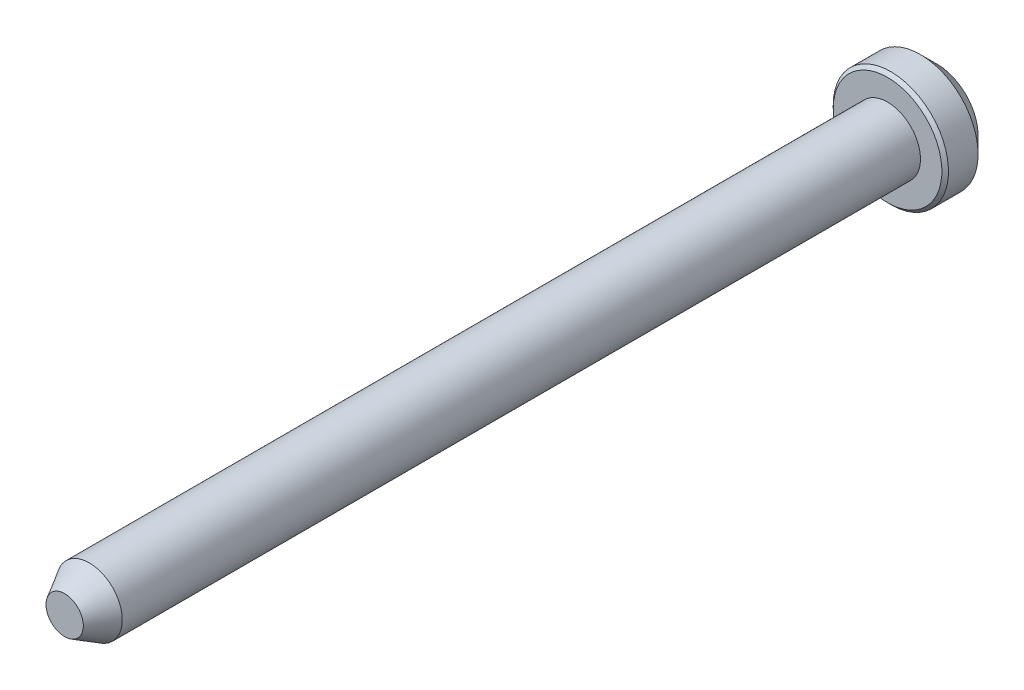
ISO-10303-21;
HEADER;
FILE_DESCRIPTION(('STEP AP214'),'2;1');
FILE_NAME('part.step','',(''),(''),'','','');
FILE_SCHEMA(('AUTOMOTIVE_DESIGN { 1 0 10303 214 1 1 1 1 }'));
ENDSEC;
DATA;
#1=APPLICATION_CONTEXT('core data for automotive mechanical design processes');
#2=APPLICATION_PROTOCOL_DEFINITION('international standard','automotive_design',2000,#1);
#3=PRODUCT_CONTEXT('',#1,'mechanical');
#4=PRODUCT('Part','Part','',(#3));
#5=PRODUCT_RELATED_PRODUCT_CATEGORY('part','',(#4));
#6=PRODUCT_DEFINITION_FORMATION('','',#4);
#7=PRODUCT_DEFINITION_CONTEXT('part definition',#1,'design');
#8=PRODUCT_DEFINITION('design','',#6,#7);
#9=PRODUCT_DEFINITION_SHAPE('','',#8);
#10=(LENGTH_UNIT() NAMED_UNIT(*) SI_UNIT(.MILLI.,.METRE.));
#11=(NAMED_UNIT(*) PLANE_ANGLE_UNIT() SI_UNIT($,.RADIAN.));
#12=(NAMED_UNIT(*) SI_UNIT($,.STERADIAN.) SOLID_ANGLE_UNIT());
#13=UNCERTAINTY_MEASURE_WITH_UNIT(LENGTH_MEASURE(1.E-05),#10,'distance_accuracy_value','');
#14=(GEOMETRIC_REPRESENTATION_CONTEXT(3) GLOBAL_UNCERTAINTY_ASSIGNED_CONTEXT((#13)) GLOBAL_UNIT_ASSIGNED_CONTEXT((#10,
#11,#12)) REPRESENTATION_CONTEXT('',''));
#15=CARTESIAN_POINT('',(0.,0.,0.));
#16=DIRECTION('',(0.,0.,1.));
#17=DIRECTION('',(1.,0.,0.));
#18=AXIS2_PLACEMENT_3D('',#15,#16,#17);
#19=CARTESIAN_POINT('',(1.13397459621557,0.,0.));
#20=DIRECTION('',(0.,0.,-1.));
#21=DIRECTION('',(-1.,0.,0.));
#22=AXIS2_PLACEMENT_3D('',#19,#20,#21);
#23=PLANE('',#22);
#24=CARTESIAN_POINT('',(0.,0.,0.));
#25=DIRECTION('',(0.,0.,-1.));
#26=DIRECTION('',(-1.,0.,0.));
#27=AXIS2_PLACEMENT_3D('',#24,#25,#26);
#28=CIRCLE('',#27,1.13397459621557);
#29=CARTESIAN_POINT('',(-1.13397459621557,0.,0.));
#30=VERTEX_POINT('',#29);
#31=EDGE_CURVE('E57',#30,#30,#28,.T.);
#32=ORIENTED_EDGE('',*,*,#31,.F.);
#33=EDGE_LOOP('',(#32));
#34=FACE_BOUND('',#33,.T.);
#35=ADVANCED_FACE('F31',(#34),#23,.F.);
#36=CARTESIAN_POINT('',(0.,0.,-53.));
#37=DIRECTION('',(0.,0.,1.));
#38=DIRECTION('',(1.,0.,0.));
#39=AXIS2_PLACEMENT_3D('',#36,#37,#38);
#40=PLANE('',#39);
#41=CARTESIAN_POINT('',(0.,0.,-53.));
#42=DIRECTION('',(0.,0.,-1.));
#43=DIRECTION('',(-1.,0.,0.));
#44=AXIS2_PLACEMENT_3D('',#41,#42,#43);
#45=CIRCLE('',#44,2.49999999999999);
#46=CARTESIAN_POINT('',(-2.49999999999999,0.,-53.));
#47=VERTEX_POINT('',#46);
#48=EDGE_CURVE('E42',#47,#47,#45,.T.);
#49=ORIENTED_EDGE('',*,*,#48,.T.);
#50=EDGE_LOOP('',(#49));
#51=FACE_BOUND('',#50,.T.);
#52=ADVANCED_FACE('F64',(#51),#40,.F.);
#53=CARTESIAN_POINT('',(0.,0.,-52.));
#54=DIRECTION('',(0.,0.,1.));
#55=DIRECTION('',(1.,0.,0.));
#56=AXIS2_PLACEMENT_3D('',#53,#54,#55);
#57=CONICAL_SURFACE('',#56,3.49999999999999,0.785398163397449);
#58=ORIENTED_EDGE('',*,*,#48,.F.);
#59=EDGE_LOOP('',(#58));
#60=FACE_BOUND('',#59,.T.);
#61=CARTESIAN_POINT('',(0.,0.,-52.));
#62=DIRECTION('',(0.,0.,-1.));
#63=DIRECTION('',(-1.,0.,0.));
#64=AXIS2_PLACEMENT_3D('',#61,#62,#63);
#65=CIRCLE('',#64,3.49999999999999);
#66=CARTESIAN_POINT('',(-3.49999999999999,0.,-52.));
#67=VERTEX_POINT('',#66);
#68=EDGE_CURVE('E46',#67,#67,#65,.T.);
#69=ORIENTED_EDGE('',*,*,#68,.T.);
#70=EDGE_LOOP('',(#69));
#71=FACE_BOUND('',#70,.T.);
#72=ADVANCED_FACE('F68',(#60,#71),#57,.T.);
#73=CARTESIAN_POINT('',(0.,0.,0.));
#74=DIRECTION('',(0.,0.,-1.));
#75=DIRECTION('',(-1.,0.,0.));
#76=AXIS2_PLACEMENT_3D('',#73,#74,#75);
#77=CYLINDRICAL_SURFACE('',#76,3.49999999999999);
#78=CARTESIAN_POINT('',(0.,0.,-50.2));
#79=DIRECTION('',(0.,0.,-1.));
#80=DIRECTION('',(-1.,0.,0.));
#81=AXIS2_PLACEMENT_3D('',#78,#79,#80);
#82=CIRCLE('',#81,3.49999999999999);
#83=CARTESIAN_POINT('',(-3.49999999999999,0.,-50.2));
#84=VERTEX_POINT('',#83);
#85=EDGE_CURVE('E38',#84,#84,#82,.T.);
#86=ORIENTED_EDGE('',*,*,#85,.T.);
#87=EDGE_LOOP('',(#86));
#88=FACE_BOUND('',#87,.T.);
#89=ORIENTED_EDGE('',*,*,#68,.F.);
#90=EDGE_LOOP('',(#89));
#91=FACE_BOUND('',#90,.T.);
#92=ADVANCED_FACE('F74',(#88,#91),#77,.T.);
#93=CARTESIAN_POINT('',(3.49999999999999,0.,-50.));
#94=DIRECTION('',(0.,0.,-1.));
#95=DIRECTION('',(-1.,0.,0.));
#96=AXIS2_PLACEMENT_3D('',#93,#94,#95);
#97=PLANE('',#96);
#98=CARTESIAN_POINT('',(0.,0.,-50.));
#99=DIRECTION('',(0.,0.,-1.));
#100=DIRECTION('',(-1.,0.,0.));
#101=AXIS2_PLACEMENT_3D('',#98,#99,#100);
#102=CIRCLE('',#101,3.29999999999999);
#103=CARTESIAN_POINT('',(-3.29999999999999,0.,-50.));
#104=VERTEX_POINT('',#103);
#105=EDGE_CURVE('E10',#104,#104,#102,.F.);
#106=ORIENTED_EDGE('',*,*,#105,.T.);
#107=EDGE_LOOP('',(#106));
#108=FACE_BOUND('',#107,.T.);
#109=CARTESIAN_POINT('',(0.,0.,-50.));
#110=DIRECTION('',(0.,0.,-1.));
#111=DIRECTION('',(-1.,0.,0.));
#112=AXIS2_PLACEMENT_3D('',#109,#110,#111);
#113=CIRCLE('',#112,1.99999999999999);
#114=CARTESIAN_POINT('',(-1.99999999999999,0.,-50.));
#115=VERTEX_POINT('',#114);
#116=EDGE_CURVE('E51',#115,#115,#113,.T.);
#117=ORIENTED_EDGE('',*,*,#116,.T.);
#118=EDGE_LOOP('',(#117));
#119=FACE_BOUND('',#118,.T.);
#120=ADVANCED_FACE('F78',(#108,#119),#97,.F.);
#121=CARTESIAN_POINT('',(0.,0.,0.));
#122=DIRECTION('',(0.,0.,-1.));
#123=DIRECTION('',(-1.,0.,0.));
#124=AXIS2_PLACEMENT_3D('',#121,#122,#123);
#125=CYLINDRICAL_SURFACE('',#124,2.);
#126=ORIENTED_EDGE('',*,*,#116,.F.);
#127=EDGE_LOOP('',(#126));
#128=FACE_BOUND('',#127,.T.);
#129=CARTESIAN_POINT('',(0.,0.,-1.5));
#130=DIRECTION('',(0.,0.,-1.));
#131=DIRECTION('',(-1.,0.,0.));
#132=AXIS2_PLACEMENT_3D('',#129,#130,#131);
#133=CIRCLE('',#132,2.);
#134=CARTESIAN_POINT('',(-2.,0.,-1.5));
#135=VERTEX_POINT('',#134);
#136=EDGE_CURVE('E54',#135,#135,#133,.T.);
#137=ORIENTED_EDGE('',*,*,#136,.T.);
#138=EDGE_LOOP('',(#137));
#139=FACE_BOUND('',#138,.T.);
#140=ADVANCED_FACE('F81',(#128,#139),#125,.T.);
#141=CARTESIAN_POINT('',(0.,0.,0.));
#142=DIRECTION('',(0.,0.,-1.));
#143=DIRECTION('',(-1.,0.,0.));
#144=AXIS2_PLACEMENT_3D('',#141,#142,#143);
#145=CONICAL_SURFACE('',#144,1.13397459621557,0.523598775598296);
#146=ORIENTED_EDGE('',*,*,#136,.F.);
#147=EDGE_LOOP('',(#146));
#148=FACE_BOUND('',#147,.T.);
#149=ORIENTED_EDGE('',*,*,#31,.T.);
#150=EDGE_LOOP('',(#149));
#151=FACE_BOUND('',#150,.T.);
#152=ADVANCED_FACE('F61',(#148,#151),#145,.T.);
#153=CARTESIAN_POINT('',(0.,0.,-50.2));
#154=DIRECTION('',(0.,0.,-1.));
#155=DIRECTION('',(-1.,0.,0.));
#156=AXIS2_PLACEMENT_3D('',#153,#154,#155);
#157=CONICAL_SURFACE('',#156,3.49999999999999,0.785398163397445);
#158=ORIENTED_EDGE('',*,*,#105,.F.);
#159=EDGE_LOOP('',(#158));
#160=FACE_BOUND('',#159,.T.);
#161=ORIENTED_EDGE('',*,*,#85,.F.);
#162=EDGE_LOOP('',(#161));
#163=FACE_BOUND('',#162,.T.);
#164=ADVANCED_FACE('F33',(#160,#163),#157,.T.);
#165=CLOSED_SHELL('',(#35,#52,#72,#92,#120,#140,#152,#164));
#166=MANIFOLD_SOLID_BREP('B2',#165);
#167=ADVANCED_BREP_SHAPE_REPRESENTATION('',(#18,#166),#14);
#168=SHAPE_DEFINITION_REPRESENTATION(#9,#167);
ENDSEC;
END-ISO-10303-21;
